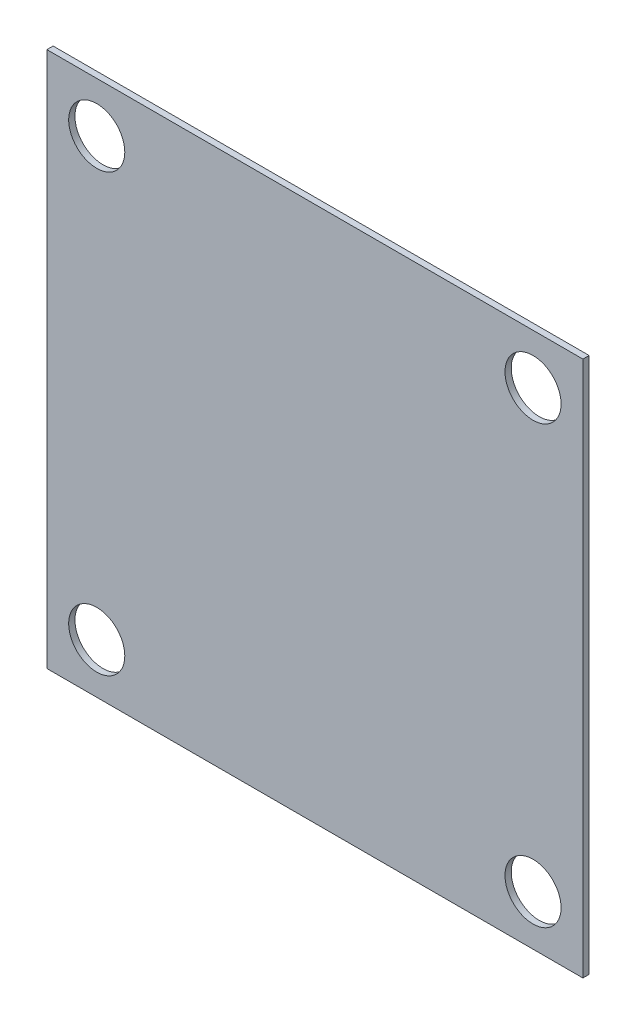
ISO-10303-21;
HEADER;
FILE_DESCRIPTION(('STEP AP214'),'2;1');
FILE_NAME('part.step','',(''),(''),'','','');
FILE_SCHEMA(('AUTOMOTIVE_DESIGN { 1 0 10303 214 1 1 1 1 }'));
ENDSEC;
DATA;
#1=APPLICATION_CONTEXT('core data for automotive mechanical design processes');
#2=APPLICATION_PROTOCOL_DEFINITION('international standard','automotive_design',2000,#1);
#3=PRODUCT_CONTEXT('',#1,'mechanical');
#4=PRODUCT('Part','Part','',(#3));
#5=PRODUCT_RELATED_PRODUCT_CATEGORY('part','',(#4));
#6=PRODUCT_DEFINITION_FORMATION('','',#4);
#7=PRODUCT_DEFINITION_CONTEXT('part definition',#1,'design');
#8=PRODUCT_DEFINITION('design','',#6,#7);
#9=PRODUCT_DEFINITION_SHAPE('','',#8);
#10=(LENGTH_UNIT() NAMED_UNIT(*) SI_UNIT(.MILLI.,.METRE.));
#11=(NAMED_UNIT(*) PLANE_ANGLE_UNIT() SI_UNIT($,.RADIAN.));
#12=(NAMED_UNIT(*) SI_UNIT($,.STERADIAN.) SOLID_ANGLE_UNIT());
#13=UNCERTAINTY_MEASURE_WITH_UNIT(LENGTH_MEASURE(1.E-05),#10,'distance_accuracy_value','');
#14=(GEOMETRIC_REPRESENTATION_CONTEXT(3) GLOBAL_UNCERTAINTY_ASSIGNED_CONTEXT((#13)) GLOBAL_UNIT_ASSIGNED_CONTEXT((#10,
#11,#12)) REPRESENTATION_CONTEXT('',''));
#15=CARTESIAN_POINT('',(0.,0.,0.));
#16=DIRECTION('',(0.,0.,1.));
#17=DIRECTION('',(1.,0.,0.));
#18=AXIS2_PLACEMENT_3D('',#15,#16,#17);
#19=CARTESIAN_POINT('',(0.,0.,1.));
#20=DIRECTION('',(0.,0.,-1.));
#21=DIRECTION('',(-1.,0.,0.));
#22=AXIS2_PLACEMENT_3D('',#19,#20,#21);
#23=PLANE('',#22);
#24=DIRECTION('',(0.,1.,0.));
#25=VECTOR('',#24,1.);
#26=CARTESIAN_POINT('',(43.,-43.,1.));
#27=LINE('',#26,#25);
#28=CARTESIAN_POINT('',(43.,-43.,1.));
#29=VERTEX_POINT('',#28);
#30=CARTESIAN_POINT('',(43.,43.,1.));
#31=VERTEX_POINT('',#30);
#32=EDGE_CURVE('E88',#29,#31,#27,.T.);
#33=ORIENTED_EDGE('',*,*,#32,.T.);
#34=DIRECTION('',(-1.,0.,0.));
#35=VECTOR('',#34,1.);
#36=CARTESIAN_POINT('',(-43.,43.,1.));
#37=LINE('',#36,#35);
#38=CARTESIAN_POINT('',(-43.,43.,1.));
#39=VERTEX_POINT('',#38);
#40=EDGE_CURVE('E83',#31,#39,#37,.T.);
#41=ORIENTED_EDGE('',*,*,#40,.T.);
#42=DIRECTION('',(0.,-1.,0.));
#43=VECTOR('',#42,1.);
#44=CARTESIAN_POINT('',(-43.,-43.,1.));
#45=LINE('',#44,#43);
#46=CARTESIAN_POINT('',(-43.,-43.,1.));
#47=VERTEX_POINT('',#46);
#48=EDGE_CURVE('E86',#39,#47,#45,.T.);
#49=ORIENTED_EDGE('',*,*,#48,.T.);
#50=DIRECTION('',(1.,0.,0.));
#51=VECTOR('',#50,1.);
#52=CARTESIAN_POINT('',(-43.,-43.,1.));
#53=LINE('',#52,#51);
#54=EDGE_CURVE('E53',#47,#29,#53,.T.);
#55=ORIENTED_EDGE('',*,*,#54,.T.);
#56=EDGE_LOOP('',(#33,#41,#49,#55));
#57=FACE_BOUND('',#56,.T.);
#58=CARTESIAN_POINT('',(35.,35.,1.));
#59=DIRECTION('',(0.,0.,1.));
#60=DIRECTION('',(1.,0.,0.));
#61=AXIS2_PLACEMENT_3D('',#58,#59,#60);
#62=CIRCLE('',#61,4.5);
#63=CARTESIAN_POINT('',(39.5,35.,1.));
#64=VERTEX_POINT('',#63);
#65=EDGE_CURVE('E103',#64,#64,#62,.T.);
#66=ORIENTED_EDGE('',*,*,#65,.F.);
#67=EDGE_LOOP('',(#66));
#68=FACE_BOUND('',#67,.T.);
#69=CARTESIAN_POINT('',(35.,-35.,1.));
#70=DIRECTION('',(0.,0.,1.));
#71=DIRECTION('',(1.,0.,0.));
#72=AXIS2_PLACEMENT_3D('',#69,#70,#71);
#73=CIRCLE('',#72,4.5);
#74=CARTESIAN_POINT('',(39.5,-35.,1.));
#75=VERTEX_POINT('',#74);
#76=EDGE_CURVE('E118',#75,#75,#73,.T.);
#77=ORIENTED_EDGE('',*,*,#76,.F.);
#78=EDGE_LOOP('',(#77));
#79=FACE_BOUND('',#78,.T.);
#80=CARTESIAN_POINT('',(-35.,35.,1.));
#81=DIRECTION('',(0.,0.,1.));
#82=DIRECTION('',(1.,0.,0.));
#83=AXIS2_PLACEMENT_3D('',#80,#81,#82);
#84=CIRCLE('',#83,4.5);
#85=CARTESIAN_POINT('',(-30.5,35.,1.));
#86=VERTEX_POINT('',#85);
#87=EDGE_CURVE('E124',#86,#86,#84,.T.);
#88=ORIENTED_EDGE('',*,*,#87,.F.);
#89=EDGE_LOOP('',(#88));
#90=FACE_BOUND('',#89,.T.);
#91=CARTESIAN_POINT('',(-35.,-35.,1.));
#92=DIRECTION('',(0.,0.,1.));
#93=DIRECTION('',(1.,0.,0.));
#94=AXIS2_PLACEMENT_3D('',#91,#92,#93);
#95=CIRCLE('',#94,4.5);
#96=CARTESIAN_POINT('',(-30.5,-35.,1.));
#97=VERTEX_POINT('',#96);
#98=EDGE_CURVE('E130',#97,#97,#95,.T.);
#99=ORIENTED_EDGE('',*,*,#98,.F.);
#100=EDGE_LOOP('',(#99));
#101=FACE_BOUND('',#100,.T.);
#102=ADVANCED_FACE('F36',(#57,#68,#79,#90,#101),#23,.F.);
#103=CARTESIAN_POINT('',(0.,0.,0.));
#104=DIRECTION('',(0.,0.,-1.));
#105=DIRECTION('',(-1.,0.,0.));
#106=AXIS2_PLACEMENT_3D('',#103,#104,#105);
#107=PLANE('',#106);
#108=CARTESIAN_POINT('',(-35.,35.,0.));
#109=DIRECTION('',(0.,0.,1.));
#110=DIRECTION('',(1.,0.,0.));
#111=AXIS2_PLACEMENT_3D('',#108,#109,#110);
#112=CIRCLE('',#111,4.5);
#113=CARTESIAN_POINT('',(-30.5,35.,0.));
#114=VERTEX_POINT('',#113);
#115=EDGE_CURVE('E127',#114,#114,#112,.T.);
#116=ORIENTED_EDGE('',*,*,#115,.T.);
#117=EDGE_LOOP('',(#116));
#118=FACE_BOUND('',#117,.T.);
#119=CARTESIAN_POINT('',(35.,35.,0.));
#120=DIRECTION('',(0.,0.,1.));
#121=DIRECTION('',(1.,0.,0.));
#122=AXIS2_PLACEMENT_3D('',#119,#120,#121);
#123=CIRCLE('',#122,4.5);
#124=CARTESIAN_POINT('',(39.5,35.,0.));
#125=VERTEX_POINT('',#124);
#126=EDGE_CURVE('E115',#125,#125,#123,.T.);
#127=ORIENTED_EDGE('',*,*,#126,.T.);
#128=EDGE_LOOP('',(#127));
#129=FACE_BOUND('',#128,.T.);
#130=DIRECTION('',(0.,1.,0.));
#131=VECTOR('',#130,1.);
#132=CARTESIAN_POINT('',(43.,-43.,0.));
#133=LINE('',#132,#131);
#134=CARTESIAN_POINT('',(43.,-43.,0.));
#135=VERTEX_POINT('',#134);
#136=CARTESIAN_POINT('',(43.,43.,0.));
#137=VERTEX_POINT('',#136);
#138=EDGE_CURVE('E100',#135,#137,#133,.T.);
#139=ORIENTED_EDGE('',*,*,#138,.F.);
#140=DIRECTION('',(1.,0.,0.));
#141=VECTOR('',#140,1.);
#142=CARTESIAN_POINT('',(-43.,-43.,0.));
#143=LINE('',#142,#141);
#144=CARTESIAN_POINT('',(-43.,-43.,0.));
#145=VERTEX_POINT('',#144);
#146=EDGE_CURVE('E76',#145,#135,#143,.T.);
#147=ORIENTED_EDGE('',*,*,#146,.F.);
#148=DIRECTION('',(0.,-1.,0.));
#149=VECTOR('',#148,1.);
#150=CARTESIAN_POINT('',(-43.,-43.,0.));
#151=LINE('',#150,#149);
#152=CARTESIAN_POINT('',(-43.,43.,0.));
#153=VERTEX_POINT('',#152);
#154=EDGE_CURVE('E70',#153,#145,#151,.T.);
#155=ORIENTED_EDGE('',*,*,#154,.F.);
#156=DIRECTION('',(-1.,0.,0.));
#157=VECTOR('',#156,1.);
#158=CARTESIAN_POINT('',(-43.,43.,0.));
#159=LINE('',#158,#157);
#160=EDGE_CURVE('E92',#137,#153,#159,.T.);
#161=ORIENTED_EDGE('',*,*,#160,.F.);
#162=EDGE_LOOP('',(#139,#147,#155,#161));
#163=FACE_BOUND('',#162,.T.);
#164=CARTESIAN_POINT('',(35.,-35.,0.));
#165=DIRECTION('',(0.,0.,1.));
#166=DIRECTION('',(1.,0.,0.));
#167=AXIS2_PLACEMENT_3D('',#164,#165,#166);
#168=CIRCLE('',#167,4.5);
#169=CARTESIAN_POINT('',(39.5,-35.,0.));
#170=VERTEX_POINT('',#169);
#171=EDGE_CURVE('E121',#170,#170,#168,.T.);
#172=ORIENTED_EDGE('',*,*,#171,.T.);
#173=EDGE_LOOP('',(#172));
#174=FACE_BOUND('',#173,.T.);
#175=CARTESIAN_POINT('',(-35.,-35.,0.));
#176=DIRECTION('',(0.,0.,1.));
#177=DIRECTION('',(1.,0.,0.));
#178=AXIS2_PLACEMENT_3D('',#175,#176,#177);
#179=CIRCLE('',#178,4.5);
#180=CARTESIAN_POINT('',(-30.5,-35.,0.));
#181=VERTEX_POINT('',#180);
#182=EDGE_CURVE('E133',#181,#181,#179,.T.);
#183=ORIENTED_EDGE('',*,*,#182,.T.);
#184=EDGE_LOOP('',(#183));
#185=FACE_BOUND('',#184,.T.);
#186=ADVANCED_FACE('F111',(#118,#129,#163,#174,#185),#107,.T.);
#187=CARTESIAN_POINT('',(43.,-43.,1.));
#188=DIRECTION('',(-1.,0.,0.));
#189=DIRECTION('',(0.,0.,1.));
#190=AXIS2_PLACEMENT_3D('',#187,#188,#189);
#191=PLANE('',#190);
#192=ORIENTED_EDGE('',*,*,#138,.T.);
#193=DIRECTION('',(0.,0.,-1.));
#194=VECTOR('',#193,1.);
#195=CARTESIAN_POINT('',(43.,43.,1.));
#196=LINE('',#195,#194);
#197=EDGE_CURVE('E11',#31,#137,#196,.T.);
#198=ORIENTED_EDGE('',*,*,#197,.F.);
#199=ORIENTED_EDGE('',*,*,#32,.F.);
#200=DIRECTION('',(0.,0.,-1.));
#201=VECTOR('',#200,1.);
#202=CARTESIAN_POINT('',(43.,-43.,1.));
#203=LINE('',#202,#201);
#204=EDGE_CURVE('E96',#29,#135,#203,.T.);
#205=ORIENTED_EDGE('',*,*,#204,.T.);
#206=EDGE_LOOP('',(#192,#198,#199,#205));
#207=FACE_BOUND('',#206,.T.);
#208=ADVANCED_FACE('F38',(#207),#191,.F.);
#209=CARTESIAN_POINT('',(-43.,43.,1.));
#210=DIRECTION('',(0.,-1.,0.));
#211=DIRECTION('',(0.,0.,-1.));
#212=AXIS2_PLACEMENT_3D('',#209,#210,#211);
#213=PLANE('',#212);
#214=ORIENTED_EDGE('',*,*,#160,.T.);
#215=DIRECTION('',(0.,0.,-1.));
#216=VECTOR('',#215,1.);
#217=CARTESIAN_POINT('',(-43.,43.,1.));
#218=LINE('',#217,#216);
#219=EDGE_CURVE('E45',#39,#153,#218,.T.);
#220=ORIENTED_EDGE('',*,*,#219,.F.);
#221=ORIENTED_EDGE('',*,*,#40,.F.);
#222=ORIENTED_EDGE('',*,*,#197,.T.);
#223=EDGE_LOOP('',(#214,#220,#221,#222));
#224=FACE_BOUND('',#223,.T.);
#225=ADVANCED_FACE('F91',(#224),#213,.F.);
#226=CARTESIAN_POINT('',(-43.,-43.,1.));
#227=DIRECTION('',(1.,0.,0.));
#228=DIRECTION('',(0.,0.,-1.));
#229=AXIS2_PLACEMENT_3D('',#226,#227,#228);
#230=PLANE('',#229);
#231=ORIENTED_EDGE('',*,*,#154,.T.);
#232=DIRECTION('',(0.,0.,-1.));
#233=VECTOR('',#232,1.);
#234=CARTESIAN_POINT('',(-43.,-43.,1.));
#235=LINE('',#234,#233);
#236=EDGE_CURVE('E93',#47,#145,#235,.T.);
#237=ORIENTED_EDGE('',*,*,#236,.F.);
#238=ORIENTED_EDGE('',*,*,#48,.F.);
#239=ORIENTED_EDGE('',*,*,#219,.T.);
#240=EDGE_LOOP('',(#231,#237,#238,#239));
#241=FACE_BOUND('',#240,.T.);
#242=ADVANCED_FACE('F94',(#241),#230,.F.);
#243=CARTESIAN_POINT('',(-43.,-43.,1.));
#244=DIRECTION('',(0.,1.,0.));
#245=DIRECTION('',(0.,0.,1.));
#246=AXIS2_PLACEMENT_3D('',#243,#244,#245);
#247=PLANE('',#246);
#248=ORIENTED_EDGE('',*,*,#146,.T.);
#249=ORIENTED_EDGE('',*,*,#204,.F.);
#250=ORIENTED_EDGE('',*,*,#54,.F.);
#251=ORIENTED_EDGE('',*,*,#236,.T.);
#252=EDGE_LOOP('',(#248,#249,#250,#251));
#253=FACE_BOUND('',#252,.T.);
#254=ADVANCED_FACE('F108',(#253),#247,.F.);
#255=CARTESIAN_POINT('',(35.,35.,1.));
#256=DIRECTION('',(0.,0.,-1.));
#257=DIRECTION('',(-1.,0.,0.));
#258=AXIS2_PLACEMENT_3D('',#255,#256,#257);
#259=CYLINDRICAL_SURFACE('',#258,4.5);
#260=ORIENTED_EDGE('',*,*,#65,.T.);
#261=EDGE_LOOP('',(#260));
#262=FACE_BOUND('',#261,.T.);
#263=ORIENTED_EDGE('',*,*,#126,.F.);
#264=EDGE_LOOP('',(#263));
#265=FACE_BOUND('',#264,.T.);
#266=ADVANCED_FACE('F150',(#262,#265),#259,.F.);
#267=CARTESIAN_POINT('',(35.,-35.,1.));
#268=DIRECTION('',(0.,0.,-1.));
#269=DIRECTION('',(-1.,0.,0.));
#270=AXIS2_PLACEMENT_3D('',#267,#268,#269);
#271=CYLINDRICAL_SURFACE('',#270,4.5);
#272=ORIENTED_EDGE('',*,*,#76,.T.);
#273=EDGE_LOOP('',(#272));
#274=FACE_BOUND('',#273,.T.);
#275=ORIENTED_EDGE('',*,*,#171,.F.);
#276=EDGE_LOOP('',(#275));
#277=FACE_BOUND('',#276,.T.);
#278=ADVANCED_FACE('F205',(#274,#277),#271,.F.);
#279=CARTESIAN_POINT('',(-35.,35.,1.));
#280=DIRECTION('',(0.,0.,-1.));
#281=DIRECTION('',(-1.,0.,0.));
#282=AXIS2_PLACEMENT_3D('',#279,#280,#281);
#283=CYLINDRICAL_SURFACE('',#282,4.5);
#284=ORIENTED_EDGE('',*,*,#87,.T.);
#285=EDGE_LOOP('',(#284));
#286=FACE_BOUND('',#285,.T.);
#287=ORIENTED_EDGE('',*,*,#115,.F.);
#288=EDGE_LOOP('',(#287));
#289=FACE_BOUND('',#288,.T.);
#290=ADVANCED_FACE('F214',(#286,#289),#283,.F.);
#291=CARTESIAN_POINT('',(-35.,-35.,1.));
#292=DIRECTION('',(0.,0.,-1.));
#293=DIRECTION('',(-1.,0.,0.));
#294=AXIS2_PLACEMENT_3D('',#291,#292,#293);
#295=CYLINDRICAL_SURFACE('',#294,4.5);
#296=ORIENTED_EDGE('',*,*,#98,.T.);
#297=EDGE_LOOP('',(#296));
#298=FACE_BOUND('',#297,.T.);
#299=ORIENTED_EDGE('',*,*,#182,.F.);
#300=EDGE_LOOP('',(#299));
#301=FACE_BOUND('',#300,.T.);
#302=ADVANCED_FACE('F139',(#298,#301),#295,.F.);
#303=CLOSED_SHELL('',(#102,#186,#208,#225,#242,#254,#266,#278,#290,#302));
#304=MANIFOLD_SOLID_BREP('B2',#303);
#305=ADVANCED_BREP_SHAPE_REPRESENTATION('',(#18,#304),#14);
#306=SHAPE_DEFINITION_REPRESENTATION(#9,#305);
ENDSEC;
END-ISO-10303-21;
